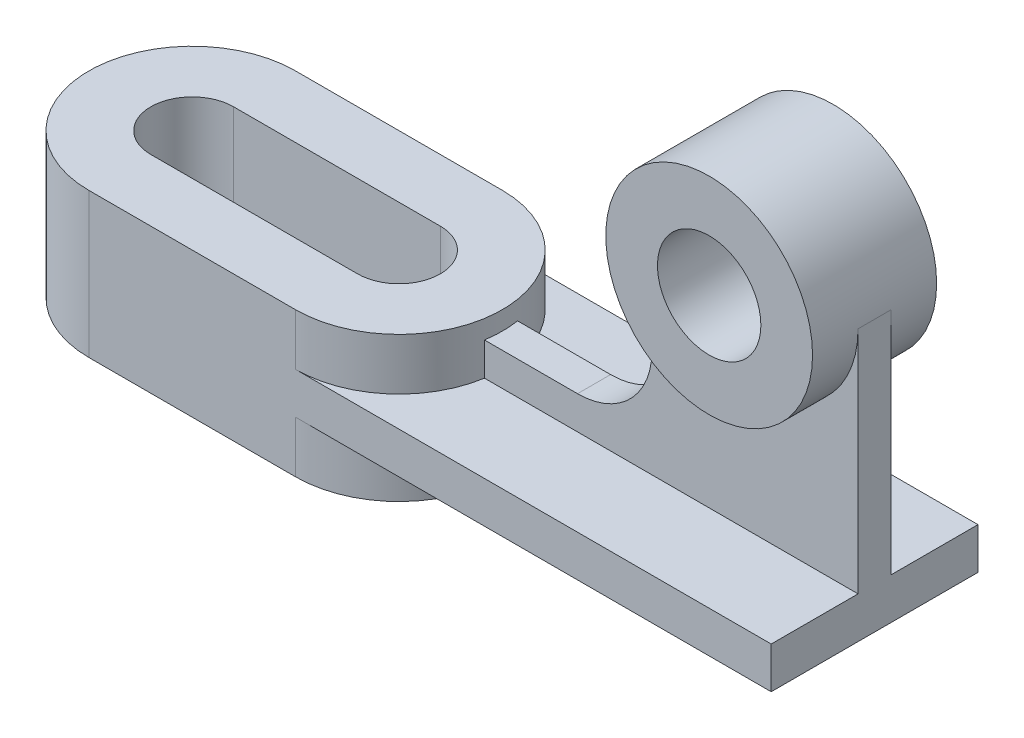
ISO-10303-21;
HEADER;
FILE_DESCRIPTION(('STEP AP214'),'2;1');
FILE_NAME('part.step','',(''),(''),'','','');
FILE_SCHEMA(('AUTOMOTIVE_DESIGN { 1 0 10303 214 1 1 1 1 }'));
ENDSEC;
DATA;
#1=APPLICATION_CONTEXT('core data for automotive mechanical design processes');
#2=APPLICATION_PROTOCOL_DEFINITION('international standard','automotive_design',2000,#1);
#3=PRODUCT_CONTEXT('',#1,'mechanical');
#4=PRODUCT('Part','Part','',(#3));
#5=PRODUCT_RELATED_PRODUCT_CATEGORY('part','',(#4));
#6=PRODUCT_DEFINITION_FORMATION('','',#4);
#7=PRODUCT_DEFINITION_CONTEXT('part definition',#1,'design');
#8=PRODUCT_DEFINITION('design','',#6,#7);
#9=PRODUCT_DEFINITION_SHAPE('','',#8);
#10=(LENGTH_UNIT() NAMED_UNIT(*) SI_UNIT(.MILLI.,.METRE.));
#11=(NAMED_UNIT(*) PLANE_ANGLE_UNIT() SI_UNIT($,.RADIAN.));
#12=(NAMED_UNIT(*) SI_UNIT($,.STERADIAN.) SOLID_ANGLE_UNIT());
#13=UNCERTAINTY_MEASURE_WITH_UNIT(LENGTH_MEASURE(1.E-05),#10,'distance_accuracy_value','');
#14=(GEOMETRIC_REPRESENTATION_CONTEXT(3) GLOBAL_UNCERTAINTY_ASSIGNED_CONTEXT((#13)) GLOBAL_UNIT_ASSIGNED_CONTEXT((#10,
#11,#12)) REPRESENTATION_CONTEXT('',''));
#15=CARTESIAN_POINT('',(0.,0.,0.));
#16=DIRECTION('',(0.,0.,1.));
#17=DIRECTION('',(1.,0.,0.));
#18=AXIS2_PLACEMENT_3D('',#15,#16,#17);
#19=CARTESIAN_POINT('',(0.,-12.5,-25.));
#20=DIRECTION('',(0.,-1.,0.));
#21=DIRECTION('',(1.,0.,0.));
#22=AXIS2_PLACEMENT_3D('',#19,#20,#21);
#23=PLANE('',#22);
#24=DIRECTION('',(-1.,0.,0.));
#25=VECTOR('',#24,1.);
#26=CARTESIAN_POINT('',(0.,-12.5,-4.));
#27=LINE('',#26,#25);
#28=CARTESIAN_POINT('',(149.341637010676,-12.5,-4.));
#29=VERTEX_POINT('',#28);
#30=CARTESIAN_POINT('',(59.0195623691823,-12.5,-4.));
#31=VERTEX_POINT('',#30);
#32=EDGE_CURVE('E340',#29,#31,#27,.T.);
#33=ORIENTED_EDGE('',*,*,#32,.F.);
#34=DIRECTION('',(0.,0.,1.));
#35=VECTOR('',#34,1.);
#36=CARTESIAN_POINT('',(149.341637010676,-12.5,-25.));
#37=LINE('',#36,#35);
#38=CARTESIAN_POINT('',(149.341637010676,-12.5,-25.));
#39=VERTEX_POINT('',#38);
#40=EDGE_CURVE('E252',#39,#29,#37,.T.);
#41=ORIENTED_EDGE('',*,*,#40,.F.);
#42=DIRECTION('',(1.,0.,0.));
#43=VECTOR('',#42,1.);
#44=CARTESIAN_POINT('',(0.,-12.5,-25.));
#45=LINE('',#44,#43);
#46=CARTESIAN_POINT('',(34.3416370106762,-12.5,-25.));
#47=VERTEX_POINT('',#46);
#48=EDGE_CURVE('E229',#47,#39,#45,.T.);
#49=ORIENTED_EDGE('',*,*,#48,.F.);
#50=CARTESIAN_POINT('',(34.3416370106762,-12.5,0.));
#51=DIRECTION('',(0.,-1.,0.));
#52=DIRECTION('',(1.,0.,0.));
#53=AXIS2_PLACEMENT_3D('',#50,#51,#52);
#54=CIRCLE('',#53,25.);
#55=EDGE_CURVE('E257',#31,#47,#54,.F.);
#56=ORIENTED_EDGE('',*,*,#55,.F.);
#57=EDGE_LOOP('',(#33,#41,#49,#56));
#58=FACE_BOUND('',#57,.T.);
#59=ADVANCED_FACE('F41',(#58),#23,.F.);
#60=CARTESIAN_POINT('',(34.3416370106762,-35.,0.));
#61=DIRECTION('',(0.,1.,0.));
#62=DIRECTION('',(0.,0.,1.));
#63=AXIS2_PLACEMENT_3D('',#60,#61,#62);
#64=CYLINDRICAL_SURFACE('',#63,25.);
#65=DIRECTION('',(0.,1.,0.));
#66=VECTOR('',#65,1.);
#67=CARTESIAN_POINT('',(59.0195623691823,-35.,4.));
#68=LINE('',#67,#66);
#69=CARTESIAN_POINT('',(59.0195623691823,-4.5,4.));
#70=VERTEX_POINT('',#69);
#71=CARTESIAN_POINT('',(59.0195623691823,-12.5,4.));
#72=VERTEX_POINT('',#71);
#73=EDGE_CURVE('E56',#70,#72,#68,.F.);
#74=ORIENTED_EDGE('',*,*,#73,.F.);
#75=CARTESIAN_POINT('',(34.3416370106762,-4.5,0.));
#76=DIRECTION('',(0.,1.,0.));
#77=DIRECTION('',(0.,0.,1.));
#78=AXIS2_PLACEMENT_3D('',#75,#76,#77);
#79=CIRCLE('',#78,25.);
#80=CARTESIAN_POINT('',(59.0195623691823,-4.5,-4.));
#81=VERTEX_POINT('',#80);
#82=EDGE_CURVE('E11',#81,#70,#79,.F.);
#83=ORIENTED_EDGE('',*,*,#82,.F.);
#84=DIRECTION('',(0.,1.,0.));
#85=VECTOR('',#84,1.);
#86=CARTESIAN_POINT('',(59.0195623691823,-35.,-4.));
#87=LINE('',#86,#85);
#88=EDGE_CURVE('E203',#81,#31,#87,.F.);
#89=ORIENTED_EDGE('',*,*,#88,.T.);
#90=ORIENTED_EDGE('',*,*,#55,.T.);
#91=DIRECTION('',(0.,1.,0.));
#92=VECTOR('',#91,1.);
#93=CARTESIAN_POINT('',(34.3416370106762,-35.,-25.));
#94=LINE('',#93,#92);
#95=CARTESIAN_POINT('',(34.3416370106762,0.,-25.));
#96=VERTEX_POINT('',#95);
#97=EDGE_CURVE('E330',#47,#96,#94,.T.);
#98=ORIENTED_EDGE('',*,*,#97,.T.);
#99=CARTESIAN_POINT('',(34.3416370106762,0.,0.));
#100=DIRECTION('',(0.,1.,0.));
#101=DIRECTION('',(0.,0.,1.));
#102=AXIS2_PLACEMENT_3D('',#99,#100,#101);
#103=CIRCLE('',#102,25.);
#104=CARTESIAN_POINT('',(34.3416370106762,0.,25.));
#105=VERTEX_POINT('',#104);
#106=EDGE_CURVE('E319',#105,#96,#103,.T.);
#107=ORIENTED_EDGE('',*,*,#106,.F.);
#108=DIRECTION('',(0.,1.,0.));
#109=VECTOR('',#108,1.);
#110=CARTESIAN_POINT('',(34.3416370106762,-35.,25.));
#111=LINE('',#110,#109);
#112=CARTESIAN_POINT('',(34.3416370106762,-12.5,25.));
#113=VERTEX_POINT('',#112);
#114=EDGE_CURVE('E334',#113,#105,#111,.T.);
#115=ORIENTED_EDGE('',*,*,#114,.F.);
#116=EDGE_CURVE('E258',#113,#72,#54,.F.);
#117=ORIENTED_EDGE('',*,*,#116,.T.);
#118=EDGE_LOOP('',(#74,#83,#89,#90,#98,#107,#115,#117));
#119=FACE_BOUND('',#118,.T.);
#120=ADVANCED_FACE('F350',(#119),#64,.T.);
#121=CARTESIAN_POINT('',(34.3416370106762,-35.,0.));
#122=DIRECTION('',(0.,1.,0.));
#123=DIRECTION('',(0.,0.,1.));
#124=AXIS2_PLACEMENT_3D('',#121,#122,#123);
#125=CYLINDRICAL_SURFACE('',#124,10.);
#126=CARTESIAN_POINT('',(34.3416370106762,-12.5,0.));
#127=DIRECTION('',(0.,-1.,0.));
#128=DIRECTION('',(1.,0.,0.));
#129=AXIS2_PLACEMENT_3D('',#126,#127,#128);
#130=CIRCLE('',#129,10.);
#131=CARTESIAN_POINT('',(34.3416370106762,-12.5,10.));
#132=VERTEX_POINT('',#131);
#133=CARTESIAN_POINT('',(34.3416370106762,-12.5,-10.));
#134=VERTEX_POINT('',#133);
#135=EDGE_CURVE('E326',#132,#134,#130,.F.);
#136=ORIENTED_EDGE('',*,*,#135,.F.);
#137=DIRECTION('',(0.,1.,0.));
#138=VECTOR('',#137,1.);
#139=CARTESIAN_POINT('',(34.3416370106762,-35.,10.));
#140=LINE('',#139,#138);
#141=CARTESIAN_POINT('',(34.3416370106762,0.,10.));
#142=VERTEX_POINT('',#141);
#143=EDGE_CURVE('E297',#132,#142,#140,.T.);
#144=ORIENTED_EDGE('',*,*,#143,.T.);
#145=CARTESIAN_POINT('',(34.3416370106762,0.,0.));
#146=DIRECTION('',(0.,1.,0.));
#147=DIRECTION('',(0.,0.,1.));
#148=AXIS2_PLACEMENT_3D('',#145,#146,#147);
#149=CIRCLE('',#148,10.);
#150=CARTESIAN_POINT('',(34.3416370106762,0.,-10.));
#151=VERTEX_POINT('',#150);
#152=EDGE_CURVE('E281',#142,#151,#149,.T.);
#153=ORIENTED_EDGE('',*,*,#152,.T.);
#154=DIRECTION('',(0.,1.,0.));
#155=VECTOR('',#154,1.);
#156=CARTESIAN_POINT('',(34.3416370106762,-35.,-10.));
#157=LINE('',#156,#155);
#158=EDGE_CURVE('E292',#134,#151,#157,.T.);
#159=ORIENTED_EDGE('',*,*,#158,.F.);
#160=EDGE_LOOP('',(#136,#144,#153,#159));
#161=FACE_BOUND('',#160,.T.);
#162=ADVANCED_FACE('F400',(#161),#125,.F.);
#163=CARTESIAN_POINT('',(-15.6583629893239,-35.,0.));
#164=DIRECTION('',(0.,1.,0.));
#165=DIRECTION('',(0.,0.,1.));
#166=AXIS2_PLACEMENT_3D('',#163,#164,#165);
#167=CYLINDRICAL_SURFACE('',#166,25.);
#168=CARTESIAN_POINT('',(-15.6583629893239,0.,0.));
#169=DIRECTION('',(0.,1.,0.));
#170=DIRECTION('',(0.,0.,1.));
#171=AXIS2_PLACEMENT_3D('',#168,#169,#170);
#172=CIRCLE('',#171,25.);
#173=CARTESIAN_POINT('',(-15.6583629893239,0.,-25.));
#174=VERTEX_POINT('',#173);
#175=CARTESIAN_POINT('',(-15.6583629893239,0.,25.));
#176=VERTEX_POINT('',#175);
#177=EDGE_CURVE('E288',#174,#176,#172,.T.);
#178=ORIENTED_EDGE('',*,*,#177,.F.);
#179=DIRECTION('',(0.,1.,0.));
#180=VECTOR('',#179,1.);
#181=CARTESIAN_POINT('',(-15.6583629893239,-35.,-25.));
#182=LINE('',#181,#180);
#183=CARTESIAN_POINT('',(-15.6583629893239,-35.,-25.));
#184=VERTEX_POINT('',#183);
#185=EDGE_CURVE('E324',#184,#174,#182,.T.);
#186=ORIENTED_EDGE('',*,*,#185,.F.);
#187=CARTESIAN_POINT('',(-15.6583629893239,-35.,0.));
#188=DIRECTION('',(0.,1.,0.));
#189=DIRECTION('',(0.,0.,1.));
#190=AXIS2_PLACEMENT_3D('',#187,#188,#189);
#191=CIRCLE('',#190,25.);
#192=CARTESIAN_POINT('',(-15.6583629893239,-35.,25.));
#193=VERTEX_POINT('',#192);
#194=EDGE_CURVE('E300',#184,#193,#191,.T.);
#195=ORIENTED_EDGE('',*,*,#194,.T.);
#196=DIRECTION('',(0.,1.,0.));
#197=VECTOR('',#196,1.);
#198=CARTESIAN_POINT('',(-15.6583629893239,-35.,25.));
#199=LINE('',#198,#197);
#200=EDGE_CURVE('E313',#193,#176,#199,.T.);
#201=ORIENTED_EDGE('',*,*,#200,.T.);
#202=EDGE_LOOP('',(#178,#186,#195,#201));
#203=FACE_BOUND('',#202,.T.);
#204=ADVANCED_FACE('F43',(#203),#167,.T.);
#205=CARTESIAN_POINT('',(-15.6583629893239,-35.,-25.));
#206=DIRECTION('',(0.,0.,-1.));
#207=DIRECTION('',(-1.,0.,0.));
#208=AXIS2_PLACEMENT_3D('',#205,#206,#207);
#209=PLANE('',#208);
#210=DIRECTION('',(-1.,0.,0.));
#211=VECTOR('',#210,1.);
#212=CARTESIAN_POINT('',(-15.6583629893239,0.,-25.));
#213=LINE('',#212,#211);
#214=EDGE_CURVE('E304',#96,#174,#213,.T.);
#215=ORIENTED_EDGE('',*,*,#214,.F.);
#216=ORIENTED_EDGE('',*,*,#97,.F.);
#217=ORIENTED_EDGE('',*,*,#48,.T.);
#218=DIRECTION('',(0.,-1.,0.));
#219=VECTOR('',#218,1.);
#220=CARTESIAN_POINT('',(149.341637010676,0.,-25.));
#221=LINE('',#220,#219);
#222=CARTESIAN_POINT('',(149.341637010676,-22.5,-25.));
#223=VERTEX_POINT('',#222);
#224=EDGE_CURVE('E227',#39,#223,#221,.T.);
#225=ORIENTED_EDGE('',*,*,#224,.T.);
#226=DIRECTION('',(1.,0.,0.));
#227=VECTOR('',#226,1.);
#228=CARTESIAN_POINT('',(0.,-22.5,-25.));
#229=LINE('',#228,#227);
#230=CARTESIAN_POINT('',(34.3416370106762,-22.5,-25.));
#231=VERTEX_POINT('',#230);
#232=EDGE_CURVE('E232',#231,#223,#229,.T.);
#233=ORIENTED_EDGE('',*,*,#232,.F.);
#234=CARTESIAN_POINT('',(34.3416370106762,-35.,-25.));
#235=VERTEX_POINT('',#234);
#236=EDGE_CURVE('E327',#235,#231,#94,.T.);
#237=ORIENTED_EDGE('',*,*,#236,.F.);
#238=DIRECTION('',(-1.,0.,0.));
#239=VECTOR('',#238,1.);
#240=CARTESIAN_POINT('',(-15.6583629893239,-35.,-25.));
#241=LINE('',#240,#239);
#242=EDGE_CURVE('E310',#235,#184,#241,.T.);
#243=ORIENTED_EDGE('',*,*,#242,.T.);
#244=ORIENTED_EDGE('',*,*,#185,.T.);
#245=EDGE_LOOP('',(#215,#216,#217,#225,#233,#237,#243,#244));
#246=FACE_BOUND('',#245,.T.);
#247=ADVANCED_FACE('F474',(#246),#209,.T.);
#248=CARTESIAN_POINT('',(34.3416370106762,-22.5,0.));
#249=DIRECTION('',(0.,-1.,0.));
#250=DIRECTION('',(0.,0.,-1.));
#251=AXIS2_PLACEMENT_3D('',#248,#249,#250);
#252=CIRCLE('',#251,25.);
#253=CARTESIAN_POINT('',(34.3416370106762,-22.5,25.));
#254=VERTEX_POINT('',#253);
#255=EDGE_CURVE('E260',#254,#231,#252,.F.);
#256=ORIENTED_EDGE('',*,*,#255,.F.);
#257=CARTESIAN_POINT('',(34.3416370106762,-35.,25.));
#258=VERTEX_POINT('',#257);
#259=EDGE_CURVE('E331',#258,#254,#111,.T.);
#260=ORIENTED_EDGE('',*,*,#259,.F.);
#261=CARTESIAN_POINT('',(34.3416370106762,-35.,0.));
#262=DIRECTION('',(0.,1.,0.));
#263=DIRECTION('',(0.,0.,1.));
#264=AXIS2_PLACEMENT_3D('',#261,#262,#263);
#265=CIRCLE('',#264,25.);
#266=EDGE_CURVE('E307',#258,#235,#265,.T.);
#267=ORIENTED_EDGE('',*,*,#266,.T.);
#268=ORIENTED_EDGE('',*,*,#236,.T.);
#269=EDGE_LOOP('',(#256,#260,#267,#268));
#270=FACE_BOUND('',#269,.T.);
#271=ADVANCED_FACE('F402',(#270),#64,.T.);
#272=CARTESIAN_POINT('',(-15.6583629893239,-35.,25.));
#273=DIRECTION('',(0.,0.,1.));
#274=DIRECTION('',(1.,0.,0.));
#275=AXIS2_PLACEMENT_3D('',#272,#273,#274);
#276=PLANE('',#275);
#277=DIRECTION('',(1.,0.,0.));
#278=VECTOR('',#277,1.);
#279=CARTESIAN_POINT('',(-15.6583629893239,0.,25.));
#280=LINE('',#279,#278);
#281=EDGE_CURVE('E316',#176,#105,#280,.T.);
#282=ORIENTED_EDGE('',*,*,#281,.F.);
#283=ORIENTED_EDGE('',*,*,#200,.F.);
#284=DIRECTION('',(1.,0.,0.));
#285=VECTOR('',#284,1.);
#286=CARTESIAN_POINT('',(-15.6583629893239,-35.,25.));
#287=LINE('',#286,#285);
#288=EDGE_CURVE('E303',#193,#258,#287,.T.);
#289=ORIENTED_EDGE('',*,*,#288,.T.);
#290=ORIENTED_EDGE('',*,*,#259,.T.);
#291=DIRECTION('',(1.,0.,0.));
#292=VECTOR('',#291,1.);
#293=CARTESIAN_POINT('',(0.,-22.5,25.));
#294=LINE('',#293,#292);
#295=CARTESIAN_POINT('',(149.341637010676,-22.5,25.));
#296=VERTEX_POINT('',#295);
#297=EDGE_CURVE('E230',#254,#296,#294,.T.);
#298=ORIENTED_EDGE('',*,*,#297,.T.);
#299=DIRECTION('',(0.,-1.,0.));
#300=VECTOR('',#299,1.);
#301=CARTESIAN_POINT('',(149.341637010676,0.,25.));
#302=LINE('',#301,#300);
#303=CARTESIAN_POINT('',(149.341637010676,-12.5,25.));
#304=VERTEX_POINT('',#303);
#305=EDGE_CURVE('E226',#304,#296,#302,.T.);
#306=ORIENTED_EDGE('',*,*,#305,.F.);
#307=DIRECTION('',(1.,0.,0.));
#308=VECTOR('',#307,1.);
#309=CARTESIAN_POINT('',(0.,-12.5,25.));
#310=LINE('',#309,#308);
#311=EDGE_CURVE('E238',#113,#304,#310,.T.);
#312=ORIENTED_EDGE('',*,*,#311,.F.);
#313=ORIENTED_EDGE('',*,*,#114,.T.);
#314=EDGE_LOOP('',(#282,#283,#289,#290,#298,#306,#312,#313));
#315=FACE_BOUND('',#314,.T.);
#316=ADVANCED_FACE('F471',(#315),#276,.T.);
#317=CARTESIAN_POINT('',(-15.6583629893239,-35.,0.));
#318=DIRECTION('',(0.,1.,0.));
#319=DIRECTION('',(0.,0.,1.));
#320=AXIS2_PLACEMENT_3D('',#317,#318,#319);
#321=PLANE('',#320);
#322=DIRECTION('',(-1.,0.,0.));
#323=VECTOR('',#322,1.);
#324=CARTESIAN_POINT('',(-15.6583629893239,-35.,-10.));
#325=LINE('',#324,#323);
#326=CARTESIAN_POINT('',(34.3416370106762,-35.,-10.));
#327=VERTEX_POINT('',#326);
#328=CARTESIAN_POINT('',(-15.6583629893239,-35.,-10.));
#329=VERTEX_POINT('',#328);
#330=EDGE_CURVE('E273',#327,#329,#325,.T.);
#331=ORIENTED_EDGE('',*,*,#330,.T.);
#332=CARTESIAN_POINT('',(-15.6583629893239,-35.,0.));
#333=DIRECTION('',(0.,1.,0.));
#334=DIRECTION('',(0.,0.,1.));
#335=AXIS2_PLACEMENT_3D('',#332,#333,#334);
#336=CIRCLE('',#335,10.);
#337=CARTESIAN_POINT('',(-15.6583629893239,-35.,10.));
#338=VERTEX_POINT('',#337);
#339=EDGE_CURVE('E263',#329,#338,#336,.T.);
#340=ORIENTED_EDGE('',*,*,#339,.T.);
#341=DIRECTION('',(1.,0.,0.));
#342=VECTOR('',#341,1.);
#343=CARTESIAN_POINT('',(-15.6583629893239,-35.,10.));
#344=LINE('',#343,#342);
#345=CARTESIAN_POINT('',(34.3416370106762,-35.,10.));
#346=VERTEX_POINT('',#345);
#347=EDGE_CURVE('E266',#338,#346,#344,.T.);
#348=ORIENTED_EDGE('',*,*,#347,.T.);
#349=CARTESIAN_POINT('',(34.3416370106762,-35.,0.));
#350=DIRECTION('',(0.,1.,0.));
#351=DIRECTION('',(0.,0.,1.));
#352=AXIS2_PLACEMENT_3D('',#349,#350,#351);
#353=CIRCLE('',#352,10.);
#354=EDGE_CURVE('E270',#346,#327,#353,.T.);
#355=ORIENTED_EDGE('',*,*,#354,.T.);
#356=EDGE_LOOP('',(#331,#340,#348,#355));
#357=FACE_BOUND('',#356,.T.);
#358=ORIENTED_EDGE('',*,*,#194,.F.);
#359=ORIENTED_EDGE('',*,*,#242,.F.);
#360=ORIENTED_EDGE('',*,*,#266,.F.);
#361=ORIENTED_EDGE('',*,*,#288,.F.);
#362=EDGE_LOOP('',(#358,#359,#360,#361));
#363=FACE_BOUND('',#362,.T.);
#364=ADVANCED_FACE('F452',(#357,#363),#321,.F.);
#365=CARTESIAN_POINT('',(-15.6583629893239,0.,0.));
#366=DIRECTION('',(0.,1.,0.));
#367=DIRECTION('',(0.,0.,1.));
#368=AXIS2_PLACEMENT_3D('',#365,#366,#367);
#369=PLANE('',#368);
#370=CARTESIAN_POINT('',(-15.6583629893239,0.,0.));
#371=DIRECTION('',(0.,1.,0.));
#372=DIRECTION('',(0.,0.,1.));
#373=AXIS2_PLACEMENT_3D('',#370,#371,#372);
#374=CIRCLE('',#373,10.);
#375=CARTESIAN_POINT('',(-15.6583629893239,0.,-10.));
#376=VERTEX_POINT('',#375);
#377=CARTESIAN_POINT('',(-15.6583629893239,0.,10.));
#378=VERTEX_POINT('',#377);
#379=EDGE_CURVE('E262',#376,#378,#374,.T.);
#380=ORIENTED_EDGE('',*,*,#379,.F.);
#381=DIRECTION('',(-1.,0.,0.));
#382=VECTOR('',#381,1.);
#383=CARTESIAN_POINT('',(-15.6583629893239,0.,-10.));
#384=LINE('',#383,#382);
#385=EDGE_CURVE('E267',#151,#376,#384,.T.);
#386=ORIENTED_EDGE('',*,*,#385,.F.);
#387=ORIENTED_EDGE('',*,*,#152,.F.);
#388=DIRECTION('',(1.,0.,0.));
#389=VECTOR('',#388,1.);
#390=CARTESIAN_POINT('',(-15.6583629893239,0.,10.));
#391=LINE('',#390,#389);
#392=EDGE_CURVE('E278',#378,#142,#391,.T.);
#393=ORIENTED_EDGE('',*,*,#392,.F.);
#394=EDGE_LOOP('',(#380,#386,#387,#393));
#395=FACE_BOUND('',#394,.T.);
#396=ORIENTED_EDGE('',*,*,#177,.T.);
#397=ORIENTED_EDGE('',*,*,#281,.T.);
#398=ORIENTED_EDGE('',*,*,#106,.T.);
#399=ORIENTED_EDGE('',*,*,#214,.T.);
#400=EDGE_LOOP('',(#396,#397,#398,#399));
#401=FACE_BOUND('',#400,.T.);
#402=ADVANCED_FACE('F445',(#395,#401),#369,.T.);
#403=CARTESIAN_POINT('',(-15.6583629893239,-35.,0.));
#404=DIRECTION('',(0.,1.,0.));
#405=DIRECTION('',(0.,0.,1.));
#406=AXIS2_PLACEMENT_3D('',#403,#404,#405);
#407=CYLINDRICAL_SURFACE('',#406,10.);
#408=ORIENTED_EDGE('',*,*,#379,.T.);
#409=DIRECTION('',(0.,1.,0.));
#410=VECTOR('',#409,1.);
#411=CARTESIAN_POINT('',(-15.6583629893239,-35.,10.));
#412=LINE('',#411,#410);
#413=EDGE_CURVE('E276',#338,#378,#412,.T.);
#414=ORIENTED_EDGE('',*,*,#413,.F.);
#415=ORIENTED_EDGE('',*,*,#339,.F.);
#416=DIRECTION('',(0.,1.,0.));
#417=VECTOR('',#416,1.);
#418=CARTESIAN_POINT('',(-15.6583629893239,-35.,-10.));
#419=LINE('',#418,#417);
#420=EDGE_CURVE('E286',#329,#376,#419,.T.);
#421=ORIENTED_EDGE('',*,*,#420,.T.);
#422=EDGE_LOOP('',(#408,#414,#415,#421));
#423=FACE_BOUND('',#422,.T.);
#424=ADVANCED_FACE('F449',(#423),#407,.F.);
#425=CARTESIAN_POINT('',(-15.6583629893239,-35.,-10.));
#426=DIRECTION('',(0.,0.,-1.));
#427=DIRECTION('',(-1.,0.,0.));
#428=AXIS2_PLACEMENT_3D('',#425,#426,#427);
#429=PLANE('',#428);
#430=ORIENTED_EDGE('',*,*,#385,.T.);
#431=ORIENTED_EDGE('',*,*,#420,.F.);
#432=ORIENTED_EDGE('',*,*,#330,.F.);
#433=CARTESIAN_POINT('',(34.3416370106762,-22.5,-10.));
#434=VERTEX_POINT('',#433);
#435=EDGE_CURVE('E289',#327,#434,#157,.T.);
#436=ORIENTED_EDGE('',*,*,#435,.T.);
#437=DIRECTION('',(0.,1.,0.));
#438=VECTOR('',#437,1.);
#439=CARTESIAN_POINT('',(34.3416370106762,-35.,-10.));
#440=LINE('',#439,#438);
#441=EDGE_CURVE('E245',#134,#434,#440,.F.);
#442=ORIENTED_EDGE('',*,*,#441,.F.);
#443=ORIENTED_EDGE('',*,*,#158,.T.);
#444=EDGE_LOOP('',(#430,#431,#432,#436,#442,#443));
#445=FACE_BOUND('',#444,.T.);
#446=ADVANCED_FACE('F436',(#445),#429,.F.);
#447=CARTESIAN_POINT('',(34.3416370106762,-22.5,10.));
#448=VERTEX_POINT('',#447);
#449=EDGE_CURVE('E293',#346,#448,#140,.T.);
#450=ORIENTED_EDGE('',*,*,#449,.T.);
#451=CARTESIAN_POINT('',(34.3416370106762,-22.5,0.));
#452=DIRECTION('',(0.,-1.,0.));
#453=DIRECTION('',(0.,0.,-1.));
#454=AXIS2_PLACEMENT_3D('',#451,#452,#453);
#455=CIRCLE('',#454,10.);
#456=EDGE_CURVE('E338',#448,#434,#455,.F.);
#457=ORIENTED_EDGE('',*,*,#456,.T.);
#458=ORIENTED_EDGE('',*,*,#435,.F.);
#459=ORIENTED_EDGE('',*,*,#354,.F.);
#460=EDGE_LOOP('',(#450,#457,#458,#459));
#461=FACE_BOUND('',#460,.T.);
#462=ADVANCED_FACE('F455',(#461),#125,.F.);
#463=CARTESIAN_POINT('',(-15.6583629893239,-35.,10.));
#464=DIRECTION('',(0.,0.,1.));
#465=DIRECTION('',(1.,0.,0.));
#466=AXIS2_PLACEMENT_3D('',#463,#464,#465);
#467=PLANE('',#466);
#468=ORIENTED_EDGE('',*,*,#392,.T.);
#469=ORIENTED_EDGE('',*,*,#143,.F.);
#470=EDGE_CURVE('E296',#448,#132,#140,.T.);
#471=ORIENTED_EDGE('',*,*,#470,.F.);
#472=ORIENTED_EDGE('',*,*,#449,.F.);
#473=ORIENTED_EDGE('',*,*,#347,.F.);
#474=ORIENTED_EDGE('',*,*,#413,.T.);
#475=EDGE_LOOP('',(#468,#469,#471,#472,#473,#474));
#476=FACE_BOUND('',#475,.T.);
#477=ADVANCED_FACE('F457',(#476),#467,.F.);
#478=CARTESIAN_POINT('',(34.3416370106762,0.,-25.));
#479=DIRECTION('',(1.,0.,0.));
#480=DIRECTION('',(0.,0.,-1.));
#481=AXIS2_PLACEMENT_3D('',#478,#479,#480);
#482=PLANE('',#481);
#483=DIRECTION('',(0.,0.,1.));
#484=VECTOR('',#483,1.);
#485=CARTESIAN_POINT('',(34.3416370106762,-12.5,-25.));
#486=LINE('',#485,#484);
#487=EDGE_CURVE('E249',#134,#132,#486,.T.);
#488=ORIENTED_EDGE('',*,*,#487,.F.);
#489=ORIENTED_EDGE('',*,*,#441,.T.);
#490=DIRECTION('',(0.,0.,1.));
#491=VECTOR('',#490,1.);
#492=CARTESIAN_POINT('',(34.3416370106762,-22.5,-25.));
#493=LINE('',#492,#491);
#494=EDGE_CURVE('E246',#434,#448,#493,.T.);
#495=ORIENTED_EDGE('',*,*,#494,.T.);
#496=ORIENTED_EDGE('',*,*,#470,.T.);
#497=EDGE_LOOP('',(#488,#489,#495,#496));
#498=FACE_BOUND('',#497,.T.);
#499=ADVANCED_FACE('F407',(#498),#482,.F.);
#500=ORIENTED_EDGE('',*,*,#487,.T.);
#501=ORIENTED_EDGE('',*,*,#135,.T.);
#502=EDGE_LOOP('',(#500,#501));
#503=FACE_BOUND('',#502,.T.);
#504=ADVANCED_FACE('F396',(#503),#23,.F.);
#505=CARTESIAN_POINT('',(0.,-22.5,-25.));
#506=DIRECTION('',(0.,-1.,0.));
#507=DIRECTION('',(0.,0.,-1.));
#508=AXIS2_PLACEMENT_3D('',#505,#506,#507);
#509=PLANE('',#508);
#510=ORIENTED_EDGE('',*,*,#456,.F.);
#511=ORIENTED_EDGE('',*,*,#494,.F.);
#512=EDGE_LOOP('',(#510,#511));
#513=FACE_BOUND('',#512,.T.);
#514=ADVANCED_FACE('F406',(#513),#509,.T.);
#515=CARTESIAN_POINT('',(149.341637010676,0.,-25.));
#516=DIRECTION('',(-1.,0.,0.));
#517=DIRECTION('',(0.,0.,1.));
#518=AXIS2_PLACEMENT_3D('',#515,#516,#517);
#519=PLANE('',#518);
#520=ORIENTED_EDGE('',*,*,#305,.T.);
#521=DIRECTION('',(0.,0.,1.));
#522=VECTOR('',#521,1.);
#523=CARTESIAN_POINT('',(149.341637010676,-22.5,-25.));
#524=LINE('',#523,#522);
#525=EDGE_CURVE('E243',#223,#296,#524,.T.);
#526=ORIENTED_EDGE('',*,*,#525,.F.);
#527=ORIENTED_EDGE('',*,*,#224,.F.);
#528=ORIENTED_EDGE('',*,*,#40,.T.);
#529=DIRECTION('',(0.,1.,0.));
#530=VECTOR('',#529,1.);
#531=CARTESIAN_POINT('',(149.341637010676,0.,-4.));
#532=LINE('',#531,#530);
#533=CARTESIAN_POINT('',(149.341637010676,43.,-4.));
#534=VERTEX_POINT('',#533);
#535=EDGE_CURVE('E215',#29,#534,#532,.T.);
#536=ORIENTED_EDGE('',*,*,#535,.T.);
#537=DIRECTION('',(0.,0.,-1.));
#538=VECTOR('',#537,1.);
#539=CARTESIAN_POINT('',(149.341637010676,43.,4.));
#540=LINE('',#539,#538);
#541=CARTESIAN_POINT('',(149.341637010676,43.,4.));
#542=VERTEX_POINT('',#541);
#543=EDGE_CURVE('E188',#542,#534,#540,.T.);
#544=ORIENTED_EDGE('',*,*,#543,.F.);
#545=DIRECTION('',(0.,1.,0.));
#546=VECTOR('',#545,1.);
#547=CARTESIAN_POINT('',(149.341637010676,0.,4.));
#548=LINE('',#547,#546);
#549=CARTESIAN_POINT('',(149.341637010676,-12.5,4.));
#550=VERTEX_POINT('',#549);
#551=EDGE_CURVE('E220',#550,#542,#548,.T.);
#552=ORIENTED_EDGE('',*,*,#551,.F.);
#553=EDGE_CURVE('E235',#550,#304,#37,.T.);
#554=ORIENTED_EDGE('',*,*,#553,.T.);
#555=EDGE_LOOP('',(#520,#526,#527,#528,#536,#544,#552,#554));
#556=FACE_BOUND('',#555,.T.);
#557=ADVANCED_FACE('F417',(#556),#519,.F.);
#558=ORIENTED_EDGE('',*,*,#297,.F.);
#559=ORIENTED_EDGE('',*,*,#255,.T.);
#560=ORIENTED_EDGE('',*,*,#232,.T.);
#561=ORIENTED_EDGE('',*,*,#525,.T.);
#562=EDGE_LOOP('',(#558,#559,#560,#561));
#563=FACE_BOUND('',#562,.T.);
#564=ADVANCED_FACE('F410',(#563),#509,.T.);
#565=ORIENTED_EDGE('',*,*,#553,.F.);
#566=DIRECTION('',(-1.,0.,0.));
#567=VECTOR('',#566,1.);
#568=CARTESIAN_POINT('',(0.,-12.5,4.));
#569=LINE('',#568,#567);
#570=EDGE_CURVE('E49',#550,#72,#569,.T.);
#571=ORIENTED_EDGE('',*,*,#570,.T.);
#572=ORIENTED_EDGE('',*,*,#116,.F.);
#573=ORIENTED_EDGE('',*,*,#311,.T.);
#574=EDGE_LOOP('',(#565,#571,#572,#573));
#575=FACE_BOUND('',#574,.T.);
#576=ADVANCED_FACE('F345',(#575),#23,.F.);
#577=CARTESIAN_POINT('',(99.3416370106762,0.,4.));
#578=DIRECTION('',(1.,0.,0.));
#579=DIRECTION('',(0.,1.,0.));
#580=AXIS2_PLACEMENT_3D('',#577,#578,#579);
#581=PLANE('',#580);
#582=DIRECTION('',(0.,-1.,0.));
#583=VECTOR('',#582,1.);
#584=CARTESIAN_POINT('',(99.3416370106762,0.,-4.));
#585=LINE('',#584,#583);
#586=CARTESIAN_POINT('',(99.3416370106762,43.,-4.));
#587=VERTEX_POINT('',#586);
#588=CARTESIAN_POINT('',(99.3416370106762,11.0446659253555,-4.));
#589=VERTEX_POINT('',#588);
#590=EDGE_CURVE('E193',#587,#589,#585,.T.);
#591=ORIENTED_EDGE('',*,*,#590,.T.);
#592=DIRECTION('',(0.,0.,-1.));
#593=VECTOR('',#592,1.);
#594=CARTESIAN_POINT('',(99.3416370106762,11.0446659253555,4.));
#595=LINE('',#594,#593);
#596=CARTESIAN_POINT('',(99.3416370106762,11.0446659253555,4.));
#597=VERTEX_POINT('',#596);
#598=EDGE_CURVE('E204',#597,#589,#595,.T.);
#599=ORIENTED_EDGE('',*,*,#598,.F.);
#600=DIRECTION('',(0.,-1.,0.));
#601=VECTOR('',#600,1.);
#602=CARTESIAN_POINT('',(99.3416370106762,0.,4.));
#603=LINE('',#602,#601);
#604=CARTESIAN_POINT('',(99.3416370106762,43.,4.));
#605=VERTEX_POINT('',#604);
#606=EDGE_CURVE('E201',#605,#597,#603,.T.);
#607=ORIENTED_EDGE('',*,*,#606,.F.);
#608=DIRECTION('',(0.,0.,-1.));
#609=VECTOR('',#608,1.);
#610=CARTESIAN_POINT('',(99.3416370106762,43.,4.));
#611=LINE('',#610,#609);
#612=EDGE_CURVE('E185',#605,#587,#611,.T.);
#613=ORIENTED_EDGE('',*,*,#612,.T.);
#614=EDGE_LOOP('',(#591,#599,#607,#613));
#615=FACE_BOUND('',#614,.T.);
#616=ADVANCED_FACE('F198',(#615),#581,.F.);
#617=CARTESIAN_POINT('',(81.5098862670759,13.5,4.));
#618=DIRECTION('',(0.,0.,-1.));
#619=DIRECTION('',(-1.,0.,0.));
#620=AXIS2_PLACEMENT_3D('',#617,#618,#619);
#621=CYLINDRICAL_SURFACE('',#620,18.);
#622=CARTESIAN_POINT('',(81.5098862670759,13.5,-4.));
#623=DIRECTION('',(0.,0.,1.));
#624=DIRECTION('',(1.,0.,0.));
#625=AXIS2_PLACEMENT_3D('',#622,#623,#624);
#626=CIRCLE('',#625,18.);
#627=CARTESIAN_POINT('',(81.5098862670759,-4.5,-4.));
#628=VERTEX_POINT('',#627);
#629=EDGE_CURVE('E208',#628,#589,#626,.T.);
#630=ORIENTED_EDGE('',*,*,#629,.F.);
#631=DIRECTION('',(0.,0.,-1.));
#632=VECTOR('',#631,1.);
#633=CARTESIAN_POINT('',(81.5098862670759,-4.5,4.));
#634=LINE('',#633,#632);
#635=CARTESIAN_POINT('',(81.5098862670759,-4.5,4.));
#636=VERTEX_POINT('',#635);
#637=EDGE_CURVE('E219',#636,#628,#634,.T.);
#638=ORIENTED_EDGE('',*,*,#637,.F.);
#639=CARTESIAN_POINT('',(81.5098862670759,13.5,4.));
#640=DIRECTION('',(0.,0.,1.));
#641=DIRECTION('',(1.,0.,0.));
#642=AXIS2_PLACEMENT_3D('',#639,#640,#641);
#643=CIRCLE('',#642,18.);
#644=EDGE_CURVE('E357',#636,#597,#643,.T.);
#645=ORIENTED_EDGE('',*,*,#644,.T.);
#646=ORIENTED_EDGE('',*,*,#598,.T.);
#647=EDGE_LOOP('',(#630,#638,#645,#646));
#648=FACE_BOUND('',#647,.T.);
#649=ADVANCED_FACE('F415',(#648),#621,.F.);
#650=CARTESIAN_POINT('',(0.,-4.5,4.));
#651=DIRECTION('',(0.,1.,0.));
#652=DIRECTION('',(0.,0.,1.));
#653=AXIS2_PLACEMENT_3D('',#650,#651,#652);
#654=PLANE('',#653);
#655=DIRECTION('',(1.,0.,0.));
#656=VECTOR('',#655,1.);
#657=CARTESIAN_POINT('',(0.,-4.5,-4.));
#658=LINE('',#657,#656);
#659=EDGE_CURVE('E210',#81,#628,#658,.T.);
#660=ORIENTED_EDGE('',*,*,#659,.F.);
#661=ORIENTED_EDGE('',*,*,#82,.T.);
#662=DIRECTION('',(1.,0.,0.));
#663=VECTOR('',#662,1.);
#664=CARTESIAN_POINT('',(0.,-4.5,4.));
#665=LINE('',#664,#663);
#666=EDGE_CURVE('E355',#70,#636,#665,.T.);
#667=ORIENTED_EDGE('',*,*,#666,.T.);
#668=ORIENTED_EDGE('',*,*,#637,.T.);
#669=EDGE_LOOP('',(#660,#661,#667,#668));
#670=FACE_BOUND('',#669,.T.);
#671=ADVANCED_FACE('F498',(#670),#654,.T.);
#672=CARTESIAN_POINT('',(0.,0.,4.));
#673=DIRECTION('',(0.,0.,1.));
#674=DIRECTION('',(1.,0.,0.));
#675=AXIS2_PLACEMENT_3D('',#672,#673,#674);
#676=PLANE('',#675);
#677=ORIENTED_EDGE('',*,*,#666,.F.);
#678=ORIENTED_EDGE('',*,*,#73,.T.);
#679=ORIENTED_EDGE('',*,*,#570,.F.);
#680=ORIENTED_EDGE('',*,*,#551,.T.);
#681=CARTESIAN_POINT('',(124.341637010676,43.,4.));
#682=DIRECTION('',(0.,0.,1.));
#683=DIRECTION('',(1.,0.,0.));
#684=AXIS2_PLACEMENT_3D('',#681,#682,#683);
#685=CIRCLE('',#684,25.);
#686=EDGE_CURVE('E217',#605,#542,#685,.T.);
#687=ORIENTED_EDGE('',*,*,#686,.F.);
#688=ORIENTED_EDGE('',*,*,#606,.T.);
#689=ORIENTED_EDGE('',*,*,#644,.F.);
#690=EDGE_LOOP('',(#677,#678,#679,#680,#687,#688,#689));
#691=FACE_BOUND('',#690,.T.);
#692=ADVANCED_FACE('F353',(#691),#676,.T.);
#693=CARTESIAN_POINT('',(0.,0.,-4.));
#694=DIRECTION('',(0.,0.,1.));
#695=DIRECTION('',(1.,0.,0.));
#696=AXIS2_PLACEMENT_3D('',#693,#694,#695);
#697=PLANE('',#696);
#698=ORIENTED_EDGE('',*,*,#88,.F.);
#699=ORIENTED_EDGE('',*,*,#659,.T.);
#700=ORIENTED_EDGE('',*,*,#629,.T.);
#701=ORIENTED_EDGE('',*,*,#590,.F.);
#702=CARTESIAN_POINT('',(124.341637010676,43.,-4.));
#703=DIRECTION('',(0.,0.,1.));
#704=DIRECTION('',(1.,0.,0.));
#705=AXIS2_PLACEMENT_3D('',#702,#703,#704);
#706=CIRCLE('',#705,25.);
#707=EDGE_CURVE('E181',#587,#534,#706,.T.);
#708=ORIENTED_EDGE('',*,*,#707,.T.);
#709=ORIENTED_EDGE('',*,*,#535,.F.);
#710=ORIENTED_EDGE('',*,*,#32,.T.);
#711=EDGE_LOOP('',(#698,#699,#700,#701,#708,#709,#710));
#712=FACE_BOUND('',#711,.T.);
#713=ADVANCED_FACE('F206',(#712),#697,.F.);
#714=CARTESIAN_POINT('',(124.341637010676,43.,15.));
#715=DIRECTION('',(0.,0.,1.));
#716=DIRECTION('',(1.,0.,0.));
#717=AXIS2_PLACEMENT_3D('',#714,#715,#716);
#718=PLANE('',#717);
#719=CARTESIAN_POINT('',(124.341637010676,43.,15.));
#720=DIRECTION('',(0.,0.,1.));
#721=DIRECTION('',(1.,0.,0.));
#722=AXIS2_PLACEMENT_3D('',#719,#720,#721);
#723=CIRCLE('',#722,25.);
#724=CARTESIAN_POINT('',(149.341637010676,43.,15.));
#725=VERTEX_POINT('',#724);
#726=EDGE_CURVE('E194',#725,#725,#723,.T.);
#727=ORIENTED_EDGE('',*,*,#726,.T.);
#728=EDGE_LOOP('',(#727));
#729=FACE_BOUND('',#728,.T.);
#730=CARTESIAN_POINT('',(124.341637010676,43.,15.));
#731=DIRECTION('',(0.,0.,1.));
#732=DIRECTION('',(1.,0.,0.));
#733=AXIS2_PLACEMENT_3D('',#730,#731,#732);
#734=CIRCLE('',#733,12.5);
#735=CARTESIAN_POINT('',(136.841637010676,43.,15.));
#736=VERTEX_POINT('',#735);
#737=EDGE_CURVE('E368',#736,#736,#734,.T.);
#738=ORIENTED_EDGE('',*,*,#737,.F.);
#739=EDGE_LOOP('',(#738));
#740=FACE_BOUND('',#739,.T.);
#741=ADVANCED_FACE('F380',(#729,#740),#718,.T.);
#742=CARTESIAN_POINT('',(124.341637010676,43.,-15.));
#743=DIRECTION('',(0.,0.,1.));
#744=DIRECTION('',(1.,0.,0.));
#745=AXIS2_PLACEMENT_3D('',#742,#743,#744);
#746=PLANE('',#745);
#747=CARTESIAN_POINT('',(124.341637010676,43.,-15.));
#748=DIRECTION('',(0.,0.,1.));
#749=DIRECTION('',(1.,0.,0.));
#750=AXIS2_PLACEMENT_3D('',#747,#748,#749);
#751=CIRCLE('',#750,25.);
#752=CARTESIAN_POINT('',(149.341637010676,43.,-15.));
#753=VERTEX_POINT('',#752);
#754=EDGE_CURVE('E365',#753,#753,#751,.T.);
#755=ORIENTED_EDGE('',*,*,#754,.F.);
#756=EDGE_LOOP('',(#755));
#757=FACE_BOUND('',#756,.T.);
#758=CARTESIAN_POINT('',(124.341637010676,43.,-15.));
#759=DIRECTION('',(0.,0.,1.));
#760=DIRECTION('',(1.,0.,0.));
#761=AXIS2_PLACEMENT_3D('',#758,#759,#760);
#762=CIRCLE('',#761,12.5);
#763=CARTESIAN_POINT('',(136.841637010676,43.,-15.));
#764=VERTEX_POINT('',#763);
#765=EDGE_CURVE('E371',#764,#764,#762,.T.);
#766=ORIENTED_EDGE('',*,*,#765,.T.);
#767=EDGE_LOOP('',(#766));
#768=FACE_BOUND('',#767,.T.);
#769=ADVANCED_FACE('F382',(#757,#768),#746,.F.);
#770=CARTESIAN_POINT('',(124.341637010676,43.,15.));
#771=DIRECTION('',(0.,0.,-1.));
#772=DIRECTION('',(-1.,0.,0.));
#773=AXIS2_PLACEMENT_3D('',#770,#771,#772);
#774=CYLINDRICAL_SURFACE('',#773,25.);
#775=ORIENTED_EDGE('',*,*,#686,.T.);
#776=ORIENTED_EDGE('',*,*,#543,.T.);
#777=ORIENTED_EDGE('',*,*,#707,.F.);
#778=ORIENTED_EDGE('',*,*,#612,.F.);
#779=EDGE_LOOP('',(#775,#776,#777,#778));
#780=FACE_BOUND('',#779,.T.);
#781=ORIENTED_EDGE('',*,*,#726,.F.);
#782=EDGE_LOOP('',(#781));
#783=FACE_BOUND('',#782,.T.);
#784=ORIENTED_EDGE('',*,*,#754,.T.);
#785=EDGE_LOOP('',(#784));
#786=FACE_BOUND('',#785,.T.);
#787=ADVANCED_FACE('F183',(#780,#783,#786),#774,.T.);
#788=CARTESIAN_POINT('',(124.341637010676,43.,15.));
#789=DIRECTION('',(0.,0.,-1.));
#790=DIRECTION('',(-1.,0.,0.));
#791=AXIS2_PLACEMENT_3D('',#788,#789,#790);
#792=CYLINDRICAL_SURFACE('',#791,12.5);
#793=ORIENTED_EDGE('',*,*,#737,.T.);
#794=EDGE_LOOP('',(#793));
#795=FACE_BOUND('',#794,.T.);
#796=ORIENTED_EDGE('',*,*,#765,.F.);
#797=EDGE_LOOP('',(#796));
#798=FACE_BOUND('',#797,.T.);
#799=ADVANCED_FACE('F377',(#795,#798),#792,.F.);
#800=CLOSED_SHELL('',(#59,#120,#162,#204,#247,#271,#316,#364,#402,#424,#446,#462,#477,#499,#504,
#514,#557,#564,#576,#616,#649,#671,#692,#713,#741,#769,#787,#799));
#801=MANIFOLD_SOLID_BREP('B2',#800);
#802=ADVANCED_BREP_SHAPE_REPRESENTATION('',(#18,#801),#14);
#803=SHAPE_DEFINITION_REPRESENTATION(#9,#802);
ENDSEC;
END-ISO-10303-21;
